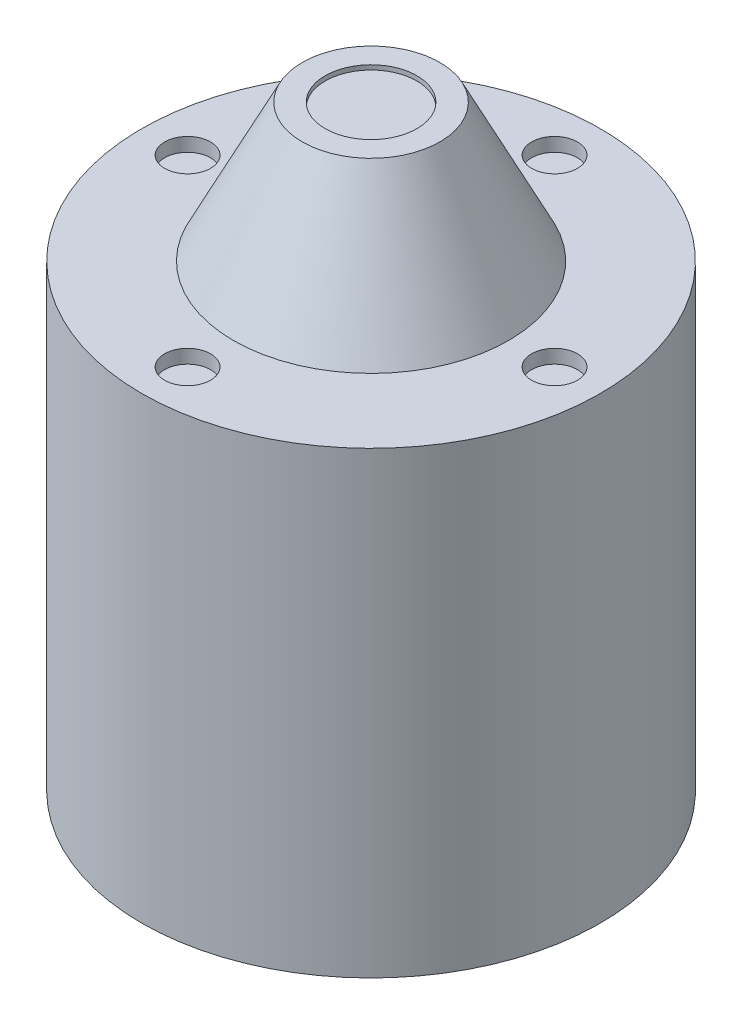
ISO-10303-21;
HEADER;
FILE_DESCRIPTION(('STEP AP214'),'2;1');
FILE_NAME('part.step','',(''),(''),'','','');
FILE_SCHEMA(('AUTOMOTIVE_DESIGN { 1 0 10303 214 1 1 1 1 }'));
ENDSEC;
DATA;
#1=APPLICATION_CONTEXT('core data for automotive mechanical design processes');
#2=APPLICATION_PROTOCOL_DEFINITION('international standard','automotive_design',2000,#1);
#3=PRODUCT_CONTEXT('',#1,'mechanical');
#4=PRODUCT('Part','Part','',(#3));
#5=PRODUCT_RELATED_PRODUCT_CATEGORY('part','',(#4));
#6=PRODUCT_DEFINITION_FORMATION('','',#4);
#7=PRODUCT_DEFINITION_CONTEXT('part definition',#1,'design');
#8=PRODUCT_DEFINITION('design','',#6,#7);
#9=PRODUCT_DEFINITION_SHAPE('','',#8);
#10=(LENGTH_UNIT() NAMED_UNIT(*) SI_UNIT(.MILLI.,.METRE.));
#11=(NAMED_UNIT(*) PLANE_ANGLE_UNIT() SI_UNIT($,.RADIAN.));
#12=(NAMED_UNIT(*) SI_UNIT($,.STERADIAN.) SOLID_ANGLE_UNIT());
#13=UNCERTAINTY_MEASURE_WITH_UNIT(LENGTH_MEASURE(1.E-05),#10,'distance_accuracy_value','');
#14=(GEOMETRIC_REPRESENTATION_CONTEXT(3) GLOBAL_UNCERTAINTY_ASSIGNED_CONTEXT((#13)) GLOBAL_UNIT_ASSIGNED_CONTEXT((#10,
#11,#12)) REPRESENTATION_CONTEXT('',''));
#15=CARTESIAN_POINT('',(0.,0.,0.));
#16=DIRECTION('',(0.,0.,1.));
#17=DIRECTION('',(1.,0.,0.));
#18=AXIS2_PLACEMENT_3D('',#15,#16,#17);
#19=CARTESIAN_POINT('',(0.,50.,0.));
#20=DIRECTION('',(0.,1.,0.));
#21=DIRECTION('',(0.,0.,1.));
#22=AXIS2_PLACEMENT_3D('',#19,#20,#21);
#23=PLANE('',#22);
#24=CARTESIAN_POINT('',(-20.,50.,0.));
#25=DIRECTION('',(0.,1.,0.));
#26=DIRECTION('',(0.,0.,1.));
#27=AXIS2_PLACEMENT_3D('',#24,#25,#26);
#28=CIRCLE('',#27,2.5);
#29=CARTESIAN_POINT('',(-20.,50.,2.5));
#30=VERTEX_POINT('',#29);
#31=EDGE_CURVE('E138',#30,#30,#28,.T.);
#32=ORIENTED_EDGE('',*,*,#31,.F.);
#33=EDGE_LOOP('',(#32));
#34=FACE_BOUND('',#33,.T.);
#35=CARTESIAN_POINT('',(0.,50.,-20.));
#36=DIRECTION('',(0.,1.,0.));
#37=DIRECTION('',(0.,0.,1.));
#38=AXIS2_PLACEMENT_3D('',#35,#36,#37);
#39=CIRCLE('',#38,2.5);
#40=CARTESIAN_POINT('',(0.,50.,-17.5));
#41=VERTEX_POINT('',#40);
#42=EDGE_CURVE('E130',#41,#41,#39,.T.);
#43=ORIENTED_EDGE('',*,*,#42,.F.);
#44=EDGE_LOOP('',(#43));
#45=FACE_BOUND('',#44,.T.);
#46=CARTESIAN_POINT('',(20.,50.,1.39645239816133E-13));
#47=DIRECTION('',(0.,1.,0.));
#48=DIRECTION('',(0.,0.,1.));
#49=AXIS2_PLACEMENT_3D('',#46,#47,#48);
#50=CIRCLE('',#49,2.5);
#51=CARTESIAN_POINT('',(20.,50.,2.50000000000014));
#52=VERTEX_POINT('',#51);
#53=EDGE_CURVE('E122',#52,#52,#50,.T.);
#54=ORIENTED_EDGE('',*,*,#53,.F.);
#55=EDGE_LOOP('',(#54));
#56=FACE_BOUND('',#55,.T.);
#57=CARTESIAN_POINT('',(-2.09901540593194E-13,50.,20.));
#58=DIRECTION('',(0.,1.,0.));
#59=DIRECTION('',(0.,0.,1.));
#60=AXIS2_PLACEMENT_3D('',#57,#58,#59);
#61=CIRCLE('',#60,2.5);
#62=CARTESIAN_POINT('',(-2.09901540593194E-13,50.,22.5));
#63=VERTEX_POINT('',#62);
#64=EDGE_CURVE('E114',#63,#63,#61,.T.);
#65=ORIENTED_EDGE('',*,*,#64,.F.);
#66=EDGE_LOOP('',(#65));
#67=FACE_BOUND('',#66,.T.);
#68=CARTESIAN_POINT('',(0.,50.,0.));
#69=DIRECTION('',(0.,1.,0.));
#70=DIRECTION('',(0.,0.,1.));
#71=AXIS2_PLACEMENT_3D('',#68,#69,#70);
#72=CIRCLE('',#71,25.);
#73=CARTESIAN_POINT('',(0.,50.,25.));
#74=VERTEX_POINT('',#73);
#75=EDGE_CURVE('E11',#74,#74,#72,.T.);
#76=ORIENTED_EDGE('',*,*,#75,.T.);
#77=EDGE_LOOP('',(#76));
#78=FACE_BOUND('',#77,.T.);
#79=CARTESIAN_POINT('',(0.,50.,0.));
#80=DIRECTION('',(0.,1.,0.));
#81=DIRECTION('',(0.,0.,1.));
#82=AXIS2_PLACEMENT_3D('',#79,#80,#81);
#83=CIRCLE('',#82,15.);
#84=CARTESIAN_POINT('',(0.,50.,15.));
#85=VERTEX_POINT('',#84);
#86=EDGE_CURVE('E60',#85,#85,#83,.T.);
#87=ORIENTED_EDGE('',*,*,#86,.F.);
#88=EDGE_LOOP('',(#87));
#89=FACE_BOUND('',#88,.T.);
#90=ADVANCED_FACE('F47',(#34,#45,#56,#67,#78,#89),#23,.T.);
#91=CARTESIAN_POINT('',(0.,50.,0.));
#92=DIRECTION('',(0.,-1.,0.));
#93=DIRECTION('',(0.,0.,-1.));
#94=AXIS2_PLACEMENT_3D('',#91,#92,#93);
#95=CYLINDRICAL_SURFACE('',#94,25.);
#96=ORIENTED_EDGE('',*,*,#75,.F.);
#97=EDGE_LOOP('',(#96));
#98=FACE_BOUND('',#97,.T.);
#99=CARTESIAN_POINT('',(0.,0.,0.));
#100=DIRECTION('',(0.,1.,0.));
#101=DIRECTION('',(0.,0.,1.));
#102=AXIS2_PLACEMENT_3D('',#99,#100,#101);
#103=CIRCLE('',#102,25.);
#104=CARTESIAN_POINT('',(0.,0.,25.));
#105=VERTEX_POINT('',#104);
#106=EDGE_CURVE('E51',#105,#105,#103,.T.);
#107=ORIENTED_EDGE('',*,*,#106,.T.);
#108=EDGE_LOOP('',(#107));
#109=FACE_BOUND('',#108,.T.);
#110=ADVANCED_FACE('F49',(#98,#109),#95,.T.);
#111=CARTESIAN_POINT('',(0.,0.,0.));
#112=DIRECTION('',(0.,1.,0.));
#113=DIRECTION('',(0.,0.,1.));
#114=AXIS2_PLACEMENT_3D('',#111,#112,#113);
#115=PLANE('',#114);
#116=ORIENTED_EDGE('',*,*,#106,.F.);
#117=EDGE_LOOP('',(#116));
#118=FACE_BOUND('',#117,.T.);
#119=ADVANCED_FACE('F88',(#118),#115,.F.);
#120=CARTESIAN_POINT('',(0.,65.,0.));
#121=DIRECTION('',(0.,1.,0.));
#122=DIRECTION('',(0.,0.,1.));
#123=AXIS2_PLACEMENT_3D('',#120,#121,#122);
#124=PLANE('',#123);
#125=CARTESIAN_POINT('',(0.,65.,0.));
#126=DIRECTION('',(0.,1.,0.));
#127=DIRECTION('',(0.,0.,1.));
#128=AXIS2_PLACEMENT_3D('',#125,#126,#127);
#129=CIRCLE('',#128,5.);
#130=CARTESIAN_POINT('',(0.,65.,5.));
#131=VERTEX_POINT('',#130);
#132=EDGE_CURVE('E106',#131,#131,#129,.T.);
#133=ORIENTED_EDGE('',*,*,#132,.F.);
#134=EDGE_LOOP('',(#133));
#135=FACE_BOUND('',#134,.T.);
#136=CARTESIAN_POINT('',(0.,65.,0.));
#137=DIRECTION('',(0.,1.,0.));
#138=DIRECTION('',(0.,0.,1.));
#139=AXIS2_PLACEMENT_3D('',#136,#137,#138);
#140=CIRCLE('',#139,7.5);
#141=CARTESIAN_POINT('',(0.,65.,7.5));
#142=VERTEX_POINT('',#141);
#143=EDGE_CURVE('E65',#142,#142,#140,.T.);
#144=ORIENTED_EDGE('',*,*,#143,.T.);
#145=EDGE_LOOP('',(#144));
#146=FACE_BOUND('',#145,.T.);
#147=ADVANCED_FACE('F77',(#135,#146),#124,.T.);
#148=CARTESIAN_POINT('',(0.,65.,0.));
#149=DIRECTION('',(0.,-1.,0.));
#150=DIRECTION('',(0.,0.,-1.));
#151=AXIS2_PLACEMENT_3D('',#148,#149,#150);
#152=CONICAL_SURFACE('',#151,7.5,0.463647609000806);
#153=ORIENTED_EDGE('',*,*,#143,.F.);
#154=EDGE_LOOP('',(#153));
#155=FACE_BOUND('',#154,.T.);
#156=ORIENTED_EDGE('',*,*,#86,.T.);
#157=EDGE_LOOP('',(#156));
#158=FACE_BOUND('',#157,.T.);
#159=ADVANCED_FACE('F87',(#155,#158),#152,.T.);
#160=CARTESIAN_POINT('',(0.,64.5,0.));
#161=DIRECTION('',(0.,1.,0.));
#162=DIRECTION('',(0.,0.,1.));
#163=AXIS2_PLACEMENT_3D('',#160,#161,#162);
#164=CYLINDRICAL_SURFACE('',#163,5.);
#165=CARTESIAN_POINT('',(0.,64.5,0.));
#166=DIRECTION('',(0.,1.,0.));
#167=DIRECTION('',(0.,0.,1.));
#168=AXIS2_PLACEMENT_3D('',#165,#166,#167);
#169=CIRCLE('',#168,5.);
#170=CARTESIAN_POINT('',(0.,64.5,5.));
#171=VERTEX_POINT('',#170);
#172=EDGE_CURVE('E71',#171,#171,#169,.T.);
#173=ORIENTED_EDGE('',*,*,#172,.F.);
#174=EDGE_LOOP('',(#173));
#175=FACE_BOUND('',#174,.T.);
#176=ORIENTED_EDGE('',*,*,#132,.T.);
#177=EDGE_LOOP('',(#176));
#178=FACE_BOUND('',#177,.T.);
#179=ADVANCED_FACE('F90',(#175,#178),#164,.F.);
#180=CARTESIAN_POINT('',(0.,64.5,0.));
#181=DIRECTION('',(0.,1.,0.));
#182=DIRECTION('',(0.,0.,1.));
#183=AXIS2_PLACEMENT_3D('',#180,#181,#182);
#184=PLANE('',#183);
#185=ORIENTED_EDGE('',*,*,#172,.T.);
#186=EDGE_LOOP('',(#185));
#187=FACE_BOUND('',#186,.T.);
#188=ADVANCED_FACE('F169',(#187),#184,.T.);
#189=CARTESIAN_POINT('',(-2.09901540593194E-13,48.5,20.));
#190=DIRECTION('',(0.,1.,0.));
#191=DIRECTION('',(0.,0.,1.));
#192=AXIS2_PLACEMENT_3D('',#189,#190,#191);
#193=CYLINDRICAL_SURFACE('',#192,2.5);
#194=CARTESIAN_POINT('',(-2.09901540593194E-13,48.5,20.));
#195=DIRECTION('',(0.,1.,0.));
#196=DIRECTION('',(0.,0.,1.));
#197=AXIS2_PLACEMENT_3D('',#194,#195,#196);
#198=CIRCLE('',#197,2.5);
#199=CARTESIAN_POINT('',(-2.09901540593194E-13,48.5,22.5));
#200=VERTEX_POINT('',#199);
#201=EDGE_CURVE('E118',#200,#200,#198,.T.);
#202=ORIENTED_EDGE('',*,*,#201,.F.);
#203=EDGE_LOOP('',(#202));
#204=FACE_BOUND('',#203,.T.);
#205=ORIENTED_EDGE('',*,*,#64,.T.);
#206=EDGE_LOOP('',(#205));
#207=FACE_BOUND('',#206,.T.);
#208=ADVANCED_FACE('F166',(#204,#207),#193,.F.);
#209=CARTESIAN_POINT('',(-2.09901540593194E-13,48.5,20.));
#210=DIRECTION('',(0.,1.,0.));
#211=DIRECTION('',(0.,0.,1.));
#212=AXIS2_PLACEMENT_3D('',#209,#210,#211);
#213=PLANE('',#212);
#214=ORIENTED_EDGE('',*,*,#201,.T.);
#215=EDGE_LOOP('',(#214));
#216=FACE_BOUND('',#215,.T.);
#217=ADVANCED_FACE('F168',(#216),#213,.T.);
#218=CARTESIAN_POINT('',(20.,48.5,1.39645239816133E-13));
#219=DIRECTION('',(0.,1.,0.));
#220=DIRECTION('',(0.,0.,1.));
#221=AXIS2_PLACEMENT_3D('',#218,#219,#220);
#222=CYLINDRICAL_SURFACE('',#221,2.5);
#223=CARTESIAN_POINT('',(20.,48.5,1.39645239816133E-13));
#224=DIRECTION('',(0.,1.,0.));
#225=DIRECTION('',(0.,0.,1.));
#226=AXIS2_PLACEMENT_3D('',#223,#224,#225);
#227=CIRCLE('',#226,2.5);
#228=CARTESIAN_POINT('',(20.,48.5,2.50000000000014));
#229=VERTEX_POINT('',#228);
#230=EDGE_CURVE('E126',#229,#229,#227,.T.);
#231=ORIENTED_EDGE('',*,*,#230,.F.);
#232=EDGE_LOOP('',(#231));
#233=FACE_BOUND('',#232,.T.);
#234=ORIENTED_EDGE('',*,*,#53,.T.);
#235=EDGE_LOOP('',(#234));
#236=FACE_BOUND('',#235,.T.);
#237=ADVANCED_FACE('F175',(#233,#236),#222,.F.);
#238=CARTESIAN_POINT('',(20.,48.5,1.39645239816133E-13));
#239=DIRECTION('',(0.,1.,0.));
#240=DIRECTION('',(0.,0.,1.));
#241=AXIS2_PLACEMENT_3D('',#238,#239,#240);
#242=PLANE('',#241);
#243=ORIENTED_EDGE('',*,*,#230,.T.);
#244=EDGE_LOOP('',(#243));
#245=FACE_BOUND('',#244,.T.);
#246=ADVANCED_FACE('F184',(#245),#242,.T.);
#247=CARTESIAN_POINT('',(0.,48.5,-20.));
#248=DIRECTION('',(0.,1.,0.));
#249=DIRECTION('',(0.,0.,1.));
#250=AXIS2_PLACEMENT_3D('',#247,#248,#249);
#251=CYLINDRICAL_SURFACE('',#250,2.5);
#252=CARTESIAN_POINT('',(0.,48.5,-20.));
#253=DIRECTION('',(0.,1.,0.));
#254=DIRECTION('',(0.,0.,1.));
#255=AXIS2_PLACEMENT_3D('',#252,#253,#254);
#256=CIRCLE('',#255,2.5);
#257=CARTESIAN_POINT('',(0.,48.5,-17.5));
#258=VERTEX_POINT('',#257);
#259=EDGE_CURVE('E134',#258,#258,#256,.T.);
#260=ORIENTED_EDGE('',*,*,#259,.F.);
#261=EDGE_LOOP('',(#260));
#262=FACE_BOUND('',#261,.T.);
#263=ORIENTED_EDGE('',*,*,#42,.T.);
#264=EDGE_LOOP('',(#263));
#265=FACE_BOUND('',#264,.T.);
#266=ADVANCED_FACE('F188',(#262,#265),#251,.F.);
#267=CARTESIAN_POINT('',(0.,48.5,-20.));
#268=DIRECTION('',(0.,1.,0.));
#269=DIRECTION('',(0.,0.,1.));
#270=AXIS2_PLACEMENT_3D('',#267,#268,#269);
#271=PLANE('',#270);
#272=ORIENTED_EDGE('',*,*,#259,.T.);
#273=EDGE_LOOP('',(#272));
#274=FACE_BOUND('',#273,.T.);
#275=ADVANCED_FACE('F151',(#274),#271,.T.);
#276=CARTESIAN_POINT('',(-20.,48.5,0.));
#277=DIRECTION('',(0.,1.,0.));
#278=DIRECTION('',(0.,0.,1.));
#279=AXIS2_PLACEMENT_3D('',#276,#277,#278);
#280=CYLINDRICAL_SURFACE('',#279,2.5);
#281=CARTESIAN_POINT('',(-20.,48.5,0.));
#282=DIRECTION('',(0.,1.,0.));
#283=DIRECTION('',(0.,0.,1.));
#284=AXIS2_PLACEMENT_3D('',#281,#282,#283);
#285=CIRCLE('',#284,2.5);
#286=CARTESIAN_POINT('',(-20.,48.5,2.5));
#287=VERTEX_POINT('',#286);
#288=EDGE_CURVE('E110',#287,#287,#285,.T.);
#289=ORIENTED_EDGE('',*,*,#288,.F.);
#290=EDGE_LOOP('',(#289));
#291=FACE_BOUND('',#290,.T.);
#292=ORIENTED_EDGE('',*,*,#31,.T.);
#293=EDGE_LOOP('',(#292));
#294=FACE_BOUND('',#293,.T.);
#295=ADVANCED_FACE('F148',(#291,#294),#280,.F.);
#296=CARTESIAN_POINT('',(-20.,48.5,0.));
#297=DIRECTION('',(0.,1.,0.));
#298=DIRECTION('',(0.,0.,1.));
#299=AXIS2_PLACEMENT_3D('',#296,#297,#298);
#300=PLANE('',#299);
#301=ORIENTED_EDGE('',*,*,#288,.T.);
#302=EDGE_LOOP('',(#301));
#303=FACE_BOUND('',#302,.T.);
#304=ADVANCED_FACE('F146',(#303),#300,.T.);
#305=CLOSED_SHELL('',(#90,#110,#119,#147,#159,#179,#188,#208,#217,#237,#246,#266,#275,#295,#304));
#306=MANIFOLD_SOLID_BREP('B2',#305);
#307=ADVANCED_BREP_SHAPE_REPRESENTATION('',(#18,#306),#14);
#308=SHAPE_DEFINITION_REPRESENTATION(#9,#307);
ENDSEC;
END-ISO-10303-21;
